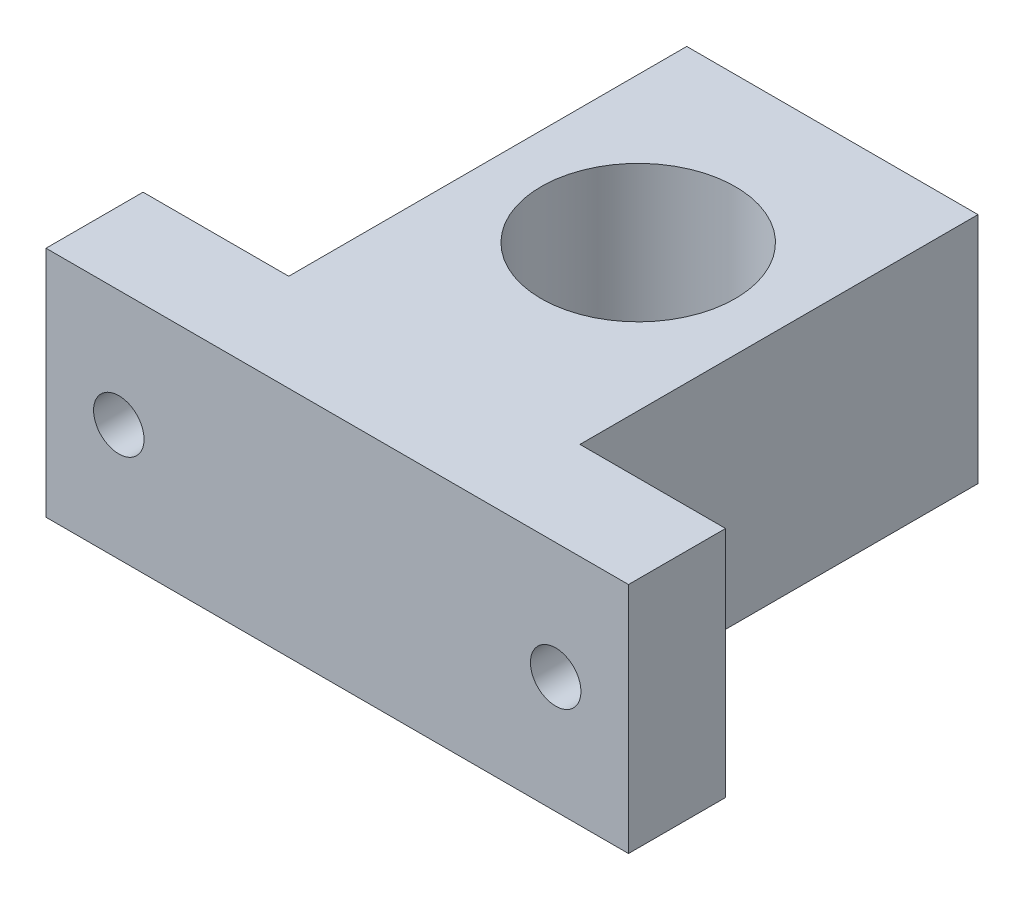
ISO-10303-21;
HEADER;
FILE_DESCRIPTION(('STEP AP214'),'2;1');
FILE_NAME('part.step','',(''),(''),'','','');
FILE_SCHEMA(('AUTOMOTIVE_DESIGN { 1 0 10303 214 1 1 1 1 }'));
ENDSEC;
DATA;
#1=APPLICATION_CONTEXT('core data for automotive mechanical design processes');
#2=APPLICATION_PROTOCOL_DEFINITION('international standard','automotive_design',2000,#1);
#3=PRODUCT_CONTEXT('',#1,'mechanical');
#4=PRODUCT('Part','Part','',(#3));
#5=PRODUCT_RELATED_PRODUCT_CATEGORY('part','',(#4));
#6=PRODUCT_DEFINITION_FORMATION('','',#4);
#7=PRODUCT_DEFINITION_CONTEXT('part definition',#1,'design');
#8=PRODUCT_DEFINITION('design','',#6,#7);
#9=PRODUCT_DEFINITION_SHAPE('','',#8);
#10=(LENGTH_UNIT() NAMED_UNIT(*) SI_UNIT(.MILLI.,.METRE.));
#11=(NAMED_UNIT(*) PLANE_ANGLE_UNIT() SI_UNIT($,.RADIAN.));
#12=(NAMED_UNIT(*) SI_UNIT($,.STERADIAN.) SOLID_ANGLE_UNIT());
#13=UNCERTAINTY_MEASURE_WITH_UNIT(LENGTH_MEASURE(1.E-05),#10,'distance_accuracy_value','');
#14=(GEOMETRIC_REPRESENTATION_CONTEXT(3) GLOBAL_UNCERTAINTY_ASSIGNED_CONTEXT((#13)) GLOBAL_UNIT_ASSIGNED_CONTEXT((#10,
#11,#12)) REPRESENTATION_CONTEXT('',''));
#15=CARTESIAN_POINT('',(0.,0.,0.));
#16=DIRECTION('',(0.,0.,1.));
#17=DIRECTION('',(1.,0.,0.));
#18=AXIS2_PLACEMENT_3D('',#15,#16,#17);
#19=CARTESIAN_POINT('',(0.,24.,0.));
#20=DIRECTION('',(0.,-1.,0.));
#21=DIRECTION('',(0.,0.,-1.));
#22=AXIS2_PLACEMENT_3D('',#19,#20,#21);
#23=PLANE('',#22);
#24=DIRECTION('',(-1.,0.,0.));
#25=VECTOR('',#24,1.);
#26=CARTESIAN_POINT('',(30.,24.,-10.));
#27=LINE('',#26,#25);
#28=CARTESIAN_POINT('',(30.,24.,-10.));
#29=VERTEX_POINT('',#28);
#30=CARTESIAN_POINT('',(15.,24.,-10.));
#31=VERTEX_POINT('',#30);
#32=EDGE_CURVE('E149',#29,#31,#27,.T.);
#33=ORIENTED_EDGE('',*,*,#32,.T.);
#34=DIRECTION('',(0.,0.,-1.));
#35=VECTOR('',#34,1.);
#36=CARTESIAN_POINT('',(15.,24.,-10.));
#37=LINE('',#36,#35);
#38=CARTESIAN_POINT('',(15.,24.,-51.));
#39=VERTEX_POINT('',#38);
#40=EDGE_CURVE('E97',#31,#39,#37,.T.);
#41=ORIENTED_EDGE('',*,*,#40,.T.);
#42=DIRECTION('',(-1.,0.,0.));
#43=VECTOR('',#42,1.);
#44=CARTESIAN_POINT('',(-15.,24.,-51.));
#45=LINE('',#44,#43);
#46=CARTESIAN_POINT('',(-15.,24.,-51.));
#47=VERTEX_POINT('',#46);
#48=EDGE_CURVE('E181',#39,#47,#45,.T.);
#49=ORIENTED_EDGE('',*,*,#48,.T.);
#50=DIRECTION('',(0.,0.,1.));
#51=VECTOR('',#50,1.);
#52=CARTESIAN_POINT('',(-15.,24.,-9.99999999999999));
#53=LINE('',#52,#51);
#54=CARTESIAN_POINT('',(-15.,24.,-9.99999999999999));
#55=VERTEX_POINT('',#54);
#56=EDGE_CURVE('E183',#47,#55,#53,.T.);
#57=ORIENTED_EDGE('',*,*,#56,.T.);
#58=DIRECTION('',(-1.,0.,0.));
#59=VECTOR('',#58,1.);
#60=CARTESIAN_POINT('',(-30.,24.,-9.99999999999999));
#61=LINE('',#60,#59);
#62=CARTESIAN_POINT('',(-30.,24.,-9.99999999999999));
#63=VERTEX_POINT('',#62);
#64=EDGE_CURVE('E116',#55,#63,#61,.T.);
#65=ORIENTED_EDGE('',*,*,#64,.T.);
#66=DIRECTION('',(0.,0.,1.));
#67=VECTOR('',#66,1.);
#68=CARTESIAN_POINT('',(-30.,24.,0.));
#69=LINE('',#68,#67);
#70=CARTESIAN_POINT('',(-30.,24.,0.));
#71=VERTEX_POINT('',#70);
#72=EDGE_CURVE('E110',#63,#71,#69,.T.);
#73=ORIENTED_EDGE('',*,*,#72,.T.);
#74=DIRECTION('',(1.,0.,0.));
#75=VECTOR('',#74,1.);
#76=CARTESIAN_POINT('',(30.,24.,0.));
#77=LINE('',#76,#75);
#78=CARTESIAN_POINT('',(30.,24.,0.));
#79=VERTEX_POINT('',#78);
#80=EDGE_CURVE('E114',#71,#79,#77,.T.);
#81=ORIENTED_EDGE('',*,*,#80,.T.);
#82=DIRECTION('',(0.,0.,-1.));
#83=VECTOR('',#82,1.);
#84=CARTESIAN_POINT('',(30.,24.,0.));
#85=LINE('',#84,#83);
#86=EDGE_CURVE('E54',#79,#29,#85,.T.);
#87=ORIENTED_EDGE('',*,*,#86,.T.);
#88=EDGE_LOOP('',(#33,#41,#49,#57,#65,#73,#81,#87));
#89=FACE_BOUND('',#88,.T.);
#90=CARTESIAN_POINT('',(0.,24.,-31.));
#91=DIRECTION('',(0.,1.,0.));
#92=DIRECTION('',(0.,0.,1.));
#93=AXIS2_PLACEMENT_3D('',#90,#91,#92);
#94=CIRCLE('',#93,10.);
#95=CARTESIAN_POINT('',(0.,24.,-21.));
#96=VERTEX_POINT('',#95);
#97=EDGE_CURVE('E138',#96,#96,#94,.T.);
#98=ORIENTED_EDGE('',*,*,#97,.F.);
#99=EDGE_LOOP('',(#98));
#100=FACE_BOUND('',#99,.T.);
#101=ADVANCED_FACE('F35',(#89,#100),#23,.F.);
#102=CARTESIAN_POINT('',(0.,0.,0.));
#103=DIRECTION('',(0.,-1.,0.));
#104=DIRECTION('',(0.,0.,-1.));
#105=AXIS2_PLACEMENT_3D('',#102,#103,#104);
#106=PLANE('',#105);
#107=DIRECTION('',(-1.,0.,0.));
#108=VECTOR('',#107,1.);
#109=CARTESIAN_POINT('',(30.,0.,-10.));
#110=LINE('',#109,#108);
#111=CARTESIAN_POINT('',(30.,0.,-10.));
#112=VERTEX_POINT('',#111);
#113=CARTESIAN_POINT('',(15.,0.,-10.));
#114=VERTEX_POINT('',#113);
#115=EDGE_CURVE('E134',#112,#114,#110,.T.);
#116=ORIENTED_EDGE('',*,*,#115,.F.);
#117=DIRECTION('',(0.,0.,-1.));
#118=VECTOR('',#117,1.);
#119=CARTESIAN_POINT('',(30.,0.,0.));
#120=LINE('',#119,#118);
#121=CARTESIAN_POINT('',(30.,0.,0.));
#122=VERTEX_POINT('',#121);
#123=EDGE_CURVE('E89',#122,#112,#120,.T.);
#124=ORIENTED_EDGE('',*,*,#123,.F.);
#125=DIRECTION('',(1.,0.,0.));
#126=VECTOR('',#125,1.);
#127=CARTESIAN_POINT('',(30.,0.,0.));
#128=LINE('',#127,#126);
#129=CARTESIAN_POINT('',(-30.,0.,0.));
#130=VERTEX_POINT('',#129);
#131=EDGE_CURVE('E83',#130,#122,#128,.T.);
#132=ORIENTED_EDGE('',*,*,#131,.F.);
#133=DIRECTION('',(0.,0.,1.));
#134=VECTOR('',#133,1.);
#135=CARTESIAN_POINT('',(-30.,0.,0.));
#136=LINE('',#135,#134);
#137=CARTESIAN_POINT('',(-30.,0.,-9.99999999999999));
#138=VERTEX_POINT('',#137);
#139=EDGE_CURVE('E124',#138,#130,#136,.T.);
#140=ORIENTED_EDGE('',*,*,#139,.F.);
#141=DIRECTION('',(-1.,0.,0.));
#142=VECTOR('',#141,1.);
#143=CARTESIAN_POINT('',(-30.,0.,-9.99999999999999));
#144=LINE('',#143,#142);
#145=CARTESIAN_POINT('',(-15.,0.,-9.99999999999999));
#146=VERTEX_POINT('',#145);
#147=EDGE_CURVE('E144',#146,#138,#144,.T.);
#148=ORIENTED_EDGE('',*,*,#147,.F.);
#149=DIRECTION('',(0.,0.,1.));
#150=VECTOR('',#149,1.);
#151=CARTESIAN_POINT('',(-15.,0.,-9.99999999999999));
#152=LINE('',#151,#150);
#153=CARTESIAN_POINT('',(-15.,0.,-51.));
#154=VERTEX_POINT('',#153);
#155=EDGE_CURVE('E142',#154,#146,#152,.T.);
#156=ORIENTED_EDGE('',*,*,#155,.F.);
#157=DIRECTION('',(-1.,0.,0.));
#158=VECTOR('',#157,1.);
#159=CARTESIAN_POINT('',(-15.,0.,-51.));
#160=LINE('',#159,#158);
#161=CARTESIAN_POINT('',(15.,0.,-51.));
#162=VERTEX_POINT('',#161);
#163=EDGE_CURVE('E140',#162,#154,#160,.T.);
#164=ORIENTED_EDGE('',*,*,#163,.F.);
#165=DIRECTION('',(0.,0.,-1.));
#166=VECTOR('',#165,1.);
#167=CARTESIAN_POINT('',(15.,0.,-10.));
#168=LINE('',#167,#166);
#169=EDGE_CURVE('E137',#114,#162,#168,.T.);
#170=ORIENTED_EDGE('',*,*,#169,.F.);
#171=EDGE_LOOP('',(#116,#124,#132,#140,#148,#156,#164,#170));
#172=FACE_BOUND('',#171,.T.);
#173=CARTESIAN_POINT('',(0.,0.,-31.));
#174=DIRECTION('',(0.,1.,0.));
#175=DIRECTION('',(0.,0.,1.));
#176=AXIS2_PLACEMENT_3D('',#173,#174,#175);
#177=CIRCLE('',#176,10.);
#178=CARTESIAN_POINT('',(0.,0.,-21.));
#179=VERTEX_POINT('',#178);
#180=EDGE_CURVE('E166',#179,#179,#177,.T.);
#181=ORIENTED_EDGE('',*,*,#180,.T.);
#182=EDGE_LOOP('',(#181));
#183=FACE_BOUND('',#182,.T.);
#184=ADVANCED_FACE('F196',(#172,#183),#106,.T.);
#185=CARTESIAN_POINT('',(30.,24.,-10.));
#186=DIRECTION('',(0.,0.,1.));
#187=DIRECTION('',(1.,0.,0.));
#188=AXIS2_PLACEMENT_3D('',#185,#186,#187);
#189=PLANE('',#188);
#190=CARTESIAN_POINT('',(22.5,12.,-9.99999999999999));
#191=DIRECTION('',(0.,0.,-1.));
#192=DIRECTION('',(-1.,0.,0.));
#193=AXIS2_PLACEMENT_3D('',#190,#191,#192);
#194=CIRCLE('',#193,2.6);
#195=CARTESIAN_POINT('',(19.9,12.,-9.99999999999999));
#196=VERTEX_POINT('',#195);
#197=EDGE_CURVE('E162',#196,#196,#194,.T.);
#198=ORIENTED_EDGE('',*,*,#197,.F.);
#199=EDGE_LOOP('',(#198));
#200=FACE_BOUND('',#199,.T.);
#201=ORIENTED_EDGE('',*,*,#115,.T.);
#202=DIRECTION('',(0.,-1.,0.));
#203=VECTOR('',#202,1.);
#204=CARTESIAN_POINT('',(15.,24.,-10.));
#205=LINE('',#204,#203);
#206=EDGE_CURVE('E11',#31,#114,#205,.T.);
#207=ORIENTED_EDGE('',*,*,#206,.F.);
#208=ORIENTED_EDGE('',*,*,#32,.F.);
#209=DIRECTION('',(0.,-1.,0.));
#210=VECTOR('',#209,1.);
#211=CARTESIAN_POINT('',(30.,24.,-10.));
#212=LINE('',#211,#210);
#213=EDGE_CURVE('E130',#29,#112,#212,.T.);
#214=ORIENTED_EDGE('',*,*,#213,.T.);
#215=EDGE_LOOP('',(#201,#207,#208,#214));
#216=FACE_BOUND('',#215,.T.);
#217=ADVANCED_FACE('F37',(#200,#216),#189,.F.);
#218=CARTESIAN_POINT('',(15.,24.,-10.));
#219=DIRECTION('',(-1.,0.,0.));
#220=DIRECTION('',(0.,0.,1.));
#221=AXIS2_PLACEMENT_3D('',#218,#219,#220);
#222=PLANE('',#221);
#223=ORIENTED_EDGE('',*,*,#169,.T.);
#224=DIRECTION('',(0.,-1.,0.));
#225=VECTOR('',#224,1.);
#226=CARTESIAN_POINT('',(15.,24.,-51.));
#227=LINE('',#226,#225);
#228=EDGE_CURVE('E45',#39,#162,#227,.T.);
#229=ORIENTED_EDGE('',*,*,#228,.F.);
#230=ORIENTED_EDGE('',*,*,#40,.F.);
#231=ORIENTED_EDGE('',*,*,#206,.T.);
#232=EDGE_LOOP('',(#223,#229,#230,#231));
#233=FACE_BOUND('',#232,.T.);
#234=ADVANCED_FACE('F252',(#233),#222,.F.);
#235=CARTESIAN_POINT('',(-15.,24.,-51.));
#236=DIRECTION('',(0.,0.,1.));
#237=DIRECTION('',(1.,0.,0.));
#238=AXIS2_PLACEMENT_3D('',#235,#236,#237);
#239=PLANE('',#238);
#240=ORIENTED_EDGE('',*,*,#163,.T.);
#241=DIRECTION('',(0.,-1.,0.));
#242=VECTOR('',#241,1.);
#243=CARTESIAN_POINT('',(-15.,24.,-51.));
#244=LINE('',#243,#242);
#245=EDGE_CURVE('E156',#47,#154,#244,.T.);
#246=ORIENTED_EDGE('',*,*,#245,.F.);
#247=ORIENTED_EDGE('',*,*,#48,.F.);
#248=ORIENTED_EDGE('',*,*,#228,.T.);
#249=EDGE_LOOP('',(#240,#246,#247,#248));
#250=FACE_BOUND('',#249,.T.);
#251=ADVANCED_FACE('F285',(#250),#239,.F.);
#252=CARTESIAN_POINT('',(-15.,24.,-9.99999999999999));
#253=DIRECTION('',(1.,0.,0.));
#254=DIRECTION('',(0.,0.,-1.));
#255=AXIS2_PLACEMENT_3D('',#252,#253,#254);
#256=PLANE('',#255);
#257=ORIENTED_EDGE('',*,*,#155,.T.);
#258=DIRECTION('',(0.,-1.,0.));
#259=VECTOR('',#258,1.);
#260=CARTESIAN_POINT('',(-15.,24.,-9.99999999999999));
#261=LINE('',#260,#259);
#262=EDGE_CURVE('E153',#55,#146,#261,.T.);
#263=ORIENTED_EDGE('',*,*,#262,.F.);
#264=ORIENTED_EDGE('',*,*,#56,.F.);
#265=ORIENTED_EDGE('',*,*,#245,.T.);
#266=EDGE_LOOP('',(#257,#263,#264,#265));
#267=FACE_BOUND('',#266,.T.);
#268=ADVANCED_FACE('F189',(#267),#256,.F.);
#269=CARTESIAN_POINT('',(-30.,24.,-9.99999999999999));
#270=DIRECTION('',(0.,0.,1.));
#271=DIRECTION('',(1.,0.,0.));
#272=AXIS2_PLACEMENT_3D('',#269,#270,#271);
#273=PLANE('',#272);
#274=CARTESIAN_POINT('',(-22.5,12.,-9.99999999999999));
#275=DIRECTION('',(0.,0.,-1.));
#276=DIRECTION('',(1.,0.,0.));
#277=AXIS2_PLACEMENT_3D('',#274,#275,#276);
#278=CIRCLE('',#277,2.6);
#279=CARTESIAN_POINT('',(-19.9,12.,-9.99999999999999));
#280=VERTEX_POINT('',#279);
#281=EDGE_CURVE('E168',#280,#280,#278,.T.);
#282=ORIENTED_EDGE('',*,*,#281,.F.);
#283=EDGE_LOOP('',(#282));
#284=FACE_BOUND('',#283,.T.);
#285=ORIENTED_EDGE('',*,*,#147,.T.);
#286=DIRECTION('',(0.,-1.,0.));
#287=VECTOR('',#286,1.);
#288=CARTESIAN_POINT('',(-30.,24.,-9.99999999999999));
#289=LINE('',#288,#287);
#290=EDGE_CURVE('E125',#63,#138,#289,.T.);
#291=ORIENTED_EDGE('',*,*,#290,.F.);
#292=ORIENTED_EDGE('',*,*,#64,.F.);
#293=ORIENTED_EDGE('',*,*,#262,.T.);
#294=EDGE_LOOP('',(#285,#291,#292,#293));
#295=FACE_BOUND('',#294,.T.);
#296=ADVANCED_FACE('F193',(#284,#295),#273,.F.);
#297=CARTESIAN_POINT('',(-30.,24.,0.));
#298=DIRECTION('',(1.,0.,0.));
#299=DIRECTION('',(0.,0.,-1.));
#300=AXIS2_PLACEMENT_3D('',#297,#298,#299);
#301=PLANE('',#300);
#302=ORIENTED_EDGE('',*,*,#139,.T.);
#303=DIRECTION('',(0.,-1.,0.));
#304=VECTOR('',#303,1.);
#305=CARTESIAN_POINT('',(-30.,24.,0.));
#306=LINE('',#305,#304);
#307=EDGE_CURVE('E121',#71,#130,#306,.T.);
#308=ORIENTED_EDGE('',*,*,#307,.F.);
#309=ORIENTED_EDGE('',*,*,#72,.F.);
#310=ORIENTED_EDGE('',*,*,#290,.T.);
#311=EDGE_LOOP('',(#302,#308,#309,#310));
#312=FACE_BOUND('',#311,.T.);
#313=ADVANCED_FACE('F122',(#312),#301,.F.);
#314=CARTESIAN_POINT('',(30.,24.,0.));
#315=DIRECTION('',(0.,0.,-1.));
#316=DIRECTION('',(-1.,0.,0.));
#317=AXIS2_PLACEMENT_3D('',#314,#315,#316);
#318=PLANE('',#317);
#319=CARTESIAN_POINT('',(22.5,12.,0.));
#320=DIRECTION('',(0.,0.,-1.));
#321=DIRECTION('',(-1.,0.,0.));
#322=AXIS2_PLACEMENT_3D('',#319,#320,#321);
#323=CIRCLE('',#322,2.6);
#324=CARTESIAN_POINT('',(19.9,12.,0.));
#325=VERTEX_POINT('',#324);
#326=EDGE_CURVE('E39',#325,#325,#323,.T.);
#327=ORIENTED_EDGE('',*,*,#326,.T.);
#328=EDGE_LOOP('',(#327));
#329=FACE_BOUND('',#328,.T.);
#330=CARTESIAN_POINT('',(-22.5,12.,0.));
#331=DIRECTION('',(0.,0.,-1.));
#332=DIRECTION('',(-1.,0.,0.));
#333=AXIS2_PLACEMENT_3D('',#330,#331,#332);
#334=CIRCLE('',#333,2.6);
#335=CARTESIAN_POINT('',(-25.1,12.,0.));
#336=VERTEX_POINT('',#335);
#337=EDGE_CURVE('E160',#336,#336,#334,.T.);
#338=ORIENTED_EDGE('',*,*,#337,.T.);
#339=EDGE_LOOP('',(#338));
#340=FACE_BOUND('',#339,.T.);
#341=ORIENTED_EDGE('',*,*,#131,.T.);
#342=DIRECTION('',(0.,-1.,0.));
#343=VECTOR('',#342,1.);
#344=CARTESIAN_POINT('',(30.,24.,0.));
#345=LINE('',#344,#343);
#346=EDGE_CURVE('E126',#79,#122,#345,.T.);
#347=ORIENTED_EDGE('',*,*,#346,.F.);
#348=ORIENTED_EDGE('',*,*,#80,.F.);
#349=ORIENTED_EDGE('',*,*,#307,.T.);
#350=EDGE_LOOP('',(#341,#347,#348,#349));
#351=FACE_BOUND('',#350,.T.);
#352=ADVANCED_FACE('F128',(#329,#340,#351),#318,.F.);
#353=CARTESIAN_POINT('',(30.,24.,0.));
#354=DIRECTION('',(-1.,0.,0.));
#355=DIRECTION('',(0.,0.,1.));
#356=AXIS2_PLACEMENT_3D('',#353,#354,#355);
#357=PLANE('',#356);
#358=ORIENTED_EDGE('',*,*,#123,.T.);
#359=ORIENTED_EDGE('',*,*,#213,.F.);
#360=ORIENTED_EDGE('',*,*,#86,.F.);
#361=ORIENTED_EDGE('',*,*,#346,.T.);
#362=EDGE_LOOP('',(#358,#359,#360,#361));
#363=FACE_BOUND('',#362,.T.);
#364=ADVANCED_FACE('F202',(#363),#357,.F.);
#365=CARTESIAN_POINT('',(0.,24.,-31.));
#366=DIRECTION('',(0.,-1.,0.));
#367=DIRECTION('',(0.,0.,-1.));
#368=AXIS2_PLACEMENT_3D('',#365,#366,#367);
#369=CYLINDRICAL_SURFACE('',#368,10.);
#370=ORIENTED_EDGE('',*,*,#97,.T.);
#371=EDGE_LOOP('',(#370));
#372=FACE_BOUND('',#371,.T.);
#373=ORIENTED_EDGE('',*,*,#180,.F.);
#374=EDGE_LOOP('',(#373));
#375=FACE_BOUND('',#374,.T.);
#376=ADVANCED_FACE('F204',(#372,#375),#369,.F.);
#377=CARTESIAN_POINT('',(-22.5,12.,14.));
#378=DIRECTION('',(0.,0.,-1.));
#379=DIRECTION('',(-1.,0.,0.));
#380=AXIS2_PLACEMENT_3D('',#377,#378,#379);
#381=CYLINDRICAL_SURFACE('',#380,2.6);
#382=ORIENTED_EDGE('',*,*,#281,.T.);
#383=EDGE_LOOP('',(#382));
#384=FACE_BOUND('',#383,.T.);
#385=ORIENTED_EDGE('',*,*,#337,.F.);
#386=EDGE_LOOP('',(#385));
#387=FACE_BOUND('',#386,.T.);
#388=ADVANCED_FACE('F210',(#384,#387),#381,.F.);
#389=CARTESIAN_POINT('',(22.5,12.,14.));
#390=DIRECTION('',(0.,0.,-1.));
#391=DIRECTION('',(-1.,0.,0.));
#392=AXIS2_PLACEMENT_3D('',#389,#390,#391);
#393=CYLINDRICAL_SURFACE('',#392,2.6);
#394=ORIENTED_EDGE('',*,*,#197,.T.);
#395=EDGE_LOOP('',(#394));
#396=FACE_BOUND('',#395,.T.);
#397=ORIENTED_EDGE('',*,*,#326,.F.);
#398=EDGE_LOOP('',(#397));
#399=FACE_BOUND('',#398,.T.);
#400=ADVANCED_FACE('F224',(#396,#399),#393,.F.);
#401=CLOSED_SHELL('',(#101,#184,#217,#234,#251,#268,#296,#313,#352,#364,#376,#388,#400));
#402=MANIFOLD_SOLID_BREP('B2',#401);
#403=ADVANCED_BREP_SHAPE_REPRESENTATION('',(#18,#402),#14);
#404=SHAPE_DEFINITION_REPRESENTATION(#9,#403);
ENDSEC;
END-ISO-10303-21;
